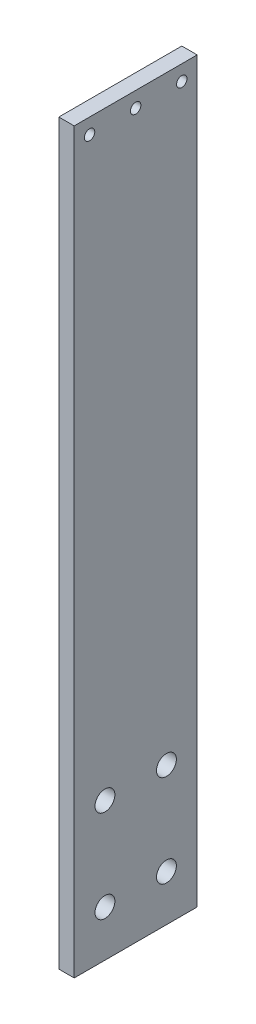
ISO-10303-21;
HEADER;
FILE_DESCRIPTION(('STEP AP214'),'2;1');
FILE_NAME('part.step','',(''),(''),'','','');
FILE_SCHEMA(('AUTOMOTIVE_DESIGN { 1 0 10303 214 1 1 1 1 }'));
ENDSEC;
DATA;
#1=APPLICATION_CONTEXT('core data for automotive mechanical design processes');
#2=APPLICATION_PROTOCOL_DEFINITION('international standard','automotive_design',2000,#1);
#3=PRODUCT_CONTEXT('',#1,'mechanical');
#4=PRODUCT('Part','Part','',(#3));
#5=PRODUCT_RELATED_PRODUCT_CATEGORY('part','',(#4));
#6=PRODUCT_DEFINITION_FORMATION('','',#4);
#7=PRODUCT_DEFINITION_CONTEXT('part definition',#1,'design');
#8=PRODUCT_DEFINITION('design','',#6,#7);
#9=PRODUCT_DEFINITION_SHAPE('','',#8);
#10=(LENGTH_UNIT() NAMED_UNIT(*) SI_UNIT(.MILLI.,.METRE.));
#11=(NAMED_UNIT(*) PLANE_ANGLE_UNIT() SI_UNIT($,.RADIAN.));
#12=(NAMED_UNIT(*) SI_UNIT($,.STERADIAN.) SOLID_ANGLE_UNIT());
#13=UNCERTAINTY_MEASURE_WITH_UNIT(LENGTH_MEASURE(1.E-05),#10,'distance_accuracy_value','');
#14=(GEOMETRIC_REPRESENTATION_CONTEXT(3) GLOBAL_UNCERTAINTY_ASSIGNED_CONTEXT((#13)) GLOBAL_UNIT_ASSIGNED_CONTEXT((#10,
#11,#12)) REPRESENTATION_CONTEXT('',''));
#15=CARTESIAN_POINT('',(0.,0.,0.));
#16=DIRECTION('',(0.,0.,1.));
#17=DIRECTION('',(1.,0.,0.));
#18=AXIS2_PLACEMENT_3D('',#15,#16,#17);
#19=CARTESIAN_POINT('',(-6.35,152.4,-25.4));
#20=DIRECTION('',(0.,0.,-1.));
#21=DIRECTION('',(0.,1.,0.));
#22=AXIS2_PLACEMENT_3D('',#19,#20,#21);
#23=PLANE('',#22);
#24=DIRECTION('',(0.,1.,0.));
#25=VECTOR('',#24,1.);
#26=CARTESIAN_POINT('',(0.,152.4,-25.4));
#27=LINE('',#26,#25);
#28=CARTESIAN_POINT('',(0.,-152.4,-25.4));
#29=VERTEX_POINT('',#28);
#30=CARTESIAN_POINT('',(0.,152.4,-25.4));
#31=VERTEX_POINT('',#30);
#32=EDGE_CURVE('E97',#29,#31,#27,.T.);
#33=ORIENTED_EDGE('',*,*,#32,.F.);
#34=DIRECTION('',(1.,0.,0.));
#35=VECTOR('',#34,1.);
#36=CARTESIAN_POINT('',(-6.35,-152.4,-25.4));
#37=LINE('',#36,#35);
#38=CARTESIAN_POINT('',(-6.35,-152.4,-25.4));
#39=VERTEX_POINT('',#38);
#40=EDGE_CURVE('E11',#39,#29,#37,.T.);
#41=ORIENTED_EDGE('',*,*,#40,.F.);
#42=DIRECTION('',(0.,1.,0.));
#43=VECTOR('',#42,1.);
#44=CARTESIAN_POINT('',(-6.35,152.4,-25.4));
#45=LINE('',#44,#43);
#46=CARTESIAN_POINT('',(-6.35,152.4,-25.4));
#47=VERTEX_POINT('',#46);
#48=EDGE_CURVE('E90',#39,#47,#45,.T.);
#49=ORIENTED_EDGE('',*,*,#48,.T.);
#50=DIRECTION('',(1.,0.,0.));
#51=VECTOR('',#50,1.);
#52=CARTESIAN_POINT('',(-6.35,152.4,-25.4));
#53=LINE('',#52,#51);
#54=EDGE_CURVE('E35',#47,#31,#53,.T.);
#55=ORIENTED_EDGE('',*,*,#54,.T.);
#56=EDGE_LOOP('',(#33,#41,#49,#55));
#57=FACE_BOUND('',#56,.T.);
#58=ADVANCED_FACE('F32',(#57),#23,.T.);
#59=CARTESIAN_POINT('',(-6.35,-152.4,25.4));
#60=DIRECTION('',(0.,-1.,0.));
#61=DIRECTION('',(0.,0.,-1.));
#62=AXIS2_PLACEMENT_3D('',#59,#60,#61);
#63=PLANE('',#62);
#64=DIRECTION('',(0.,0.,-1.));
#65=VECTOR('',#64,1.);
#66=CARTESIAN_POINT('',(0.,-152.4,25.4));
#67=LINE('',#66,#65);
#68=CARTESIAN_POINT('',(0.,-152.4,25.4));
#69=VERTEX_POINT('',#68);
#70=EDGE_CURVE('E92',#69,#29,#67,.T.);
#71=ORIENTED_EDGE('',*,*,#70,.F.);
#72=DIRECTION('',(1.,0.,0.));
#73=VECTOR('',#72,1.);
#74=CARTESIAN_POINT('',(-6.35,-152.4,25.4));
#75=LINE('',#74,#73);
#76=CARTESIAN_POINT('',(-6.35,-152.4,25.4));
#77=VERTEX_POINT('',#76);
#78=EDGE_CURVE('E41',#77,#69,#75,.T.);
#79=ORIENTED_EDGE('',*,*,#78,.F.);
#80=DIRECTION('',(0.,0.,-1.));
#81=VECTOR('',#80,1.);
#82=CARTESIAN_POINT('',(-6.35,-152.4,25.4));
#83=LINE('',#82,#81);
#84=EDGE_CURVE('E87',#77,#39,#83,.T.);
#85=ORIENTED_EDGE('',*,*,#84,.T.);
#86=ORIENTED_EDGE('',*,*,#40,.T.);
#87=EDGE_LOOP('',(#71,#79,#85,#86));
#88=FACE_BOUND('',#87,.T.);
#89=ADVANCED_FACE('F108',(#88),#63,.T.);
#90=CARTESIAN_POINT('',(-6.35,152.4,25.4));
#91=DIRECTION('',(0.,0.,1.));
#92=DIRECTION('',(0.,-1.,0.));
#93=AXIS2_PLACEMENT_3D('',#90,#91,#92);
#94=PLANE('',#93);
#95=DIRECTION('',(0.,-1.,0.));
#96=VECTOR('',#95,1.);
#97=CARTESIAN_POINT('',(0.,152.4,25.4));
#98=LINE('',#97,#96);
#99=CARTESIAN_POINT('',(0.,152.4,25.4));
#100=VERTEX_POINT('',#99);
#101=EDGE_CURVE('E82',#100,#69,#98,.T.);
#102=ORIENTED_EDGE('',*,*,#101,.F.);
#103=DIRECTION('',(1.,0.,0.));
#104=VECTOR('',#103,1.);
#105=CARTESIAN_POINT('',(-6.35,152.4,25.4));
#106=LINE('',#105,#104);
#107=CARTESIAN_POINT('',(-6.35,152.4,25.4));
#108=VERTEX_POINT('',#107);
#109=EDGE_CURVE('E77',#108,#100,#106,.T.);
#110=ORIENTED_EDGE('',*,*,#109,.F.);
#111=DIRECTION('',(0.,-1.,0.));
#112=VECTOR('',#111,1.);
#113=CARTESIAN_POINT('',(-6.35,152.4,25.4));
#114=LINE('',#113,#112);
#115=EDGE_CURVE('E80',#108,#77,#114,.T.);
#116=ORIENTED_EDGE('',*,*,#115,.T.);
#117=ORIENTED_EDGE('',*,*,#78,.T.);
#118=EDGE_LOOP('',(#102,#110,#116,#117));
#119=FACE_BOUND('',#118,.T.);
#120=ADVANCED_FACE('F79',(#119),#94,.T.);
#121=CARTESIAN_POINT('',(-6.35,152.4,25.4));
#122=DIRECTION('',(0.,1.,0.));
#123=DIRECTION('',(0.,0.,1.));
#124=AXIS2_PLACEMENT_3D('',#121,#122,#123);
#125=PLANE('',#124);
#126=DIRECTION('',(0.,0.,1.));
#127=VECTOR('',#126,1.);
#128=CARTESIAN_POINT('',(0.,152.4,25.4));
#129=LINE('',#128,#127);
#130=EDGE_CURVE('E100',#31,#100,#129,.T.);
#131=ORIENTED_EDGE('',*,*,#130,.F.);
#132=ORIENTED_EDGE('',*,*,#54,.F.);
#133=DIRECTION('',(0.,0.,1.));
#134=VECTOR('',#133,1.);
#135=CARTESIAN_POINT('',(-6.35,152.4,25.4));
#136=LINE('',#135,#134);
#137=EDGE_CURVE('E86',#47,#108,#136,.T.);
#138=ORIENTED_EDGE('',*,*,#137,.T.);
#139=ORIENTED_EDGE('',*,*,#109,.T.);
#140=EDGE_LOOP('',(#131,#132,#138,#139));
#141=FACE_BOUND('',#140,.T.);
#142=ADVANCED_FACE('F89',(#141),#125,.T.);
#143=CARTESIAN_POINT('',(-6.35,0.,0.));
#144=DIRECTION('',(1.,0.,0.));
#145=DIRECTION('',(0.,0.,-1.));
#146=AXIS2_PLACEMENT_3D('',#143,#144,#145);
#147=PLANE('',#146);
#148=CARTESIAN_POINT('',(-6.35,146.05,-19.05));
#149=DIRECTION('',(1.,0.,0.));
#150=DIRECTION('',(0.,0.,-1.));
#151=AXIS2_PLACEMENT_3D('',#148,#149,#150);
#152=CIRCLE('',#151,2.15265);
#153=CARTESIAN_POINT('',(-6.35,146.05,-21.20265));
#154=VERTEX_POINT('',#153);
#155=EDGE_CURVE('E177',#154,#154,#152,.T.);
#156=ORIENTED_EDGE('',*,*,#155,.T.);
#157=EDGE_LOOP('',(#156));
#158=FACE_BOUND('',#157,.T.);
#159=CARTESIAN_POINT('',(-6.35,146.05,0.));
#160=DIRECTION('',(1.,0.,0.));
#161=DIRECTION('',(0.,0.,-1.));
#162=AXIS2_PLACEMENT_3D('',#159,#160,#161);
#163=CIRCLE('',#162,2.15265);
#164=CARTESIAN_POINT('',(-6.35,146.05,-2.15264999999998));
#165=VERTEX_POINT('',#164);
#166=EDGE_CURVE('E167',#165,#165,#163,.T.);
#167=ORIENTED_EDGE('',*,*,#166,.T.);
#168=EDGE_LOOP('',(#167));
#169=FACE_BOUND('',#168,.T.);
#170=CARTESIAN_POINT('',(-6.35,-133.35,12.7));
#171=DIRECTION('',(1.,0.,0.));
#172=DIRECTION('',(0.,0.,-1.));
#173=AXIS2_PLACEMENT_3D('',#170,#171,#172);
#174=CIRCLE('',#173,4.10210000000001);
#175=CARTESIAN_POINT('',(-6.35,-133.35,8.59790000000002));
#176=VERTEX_POINT('',#175);
#177=EDGE_CURVE('E162',#176,#176,#174,.T.);
#178=ORIENTED_EDGE('',*,*,#177,.T.);
#179=EDGE_LOOP('',(#178));
#180=FACE_BOUND('',#179,.T.);
#181=CARTESIAN_POINT('',(-6.35,-133.35,-12.7));
#182=DIRECTION('',(1.,0.,0.));
#183=DIRECTION('',(0.,0.,-1.));
#184=AXIS2_PLACEMENT_3D('',#181,#182,#183);
#185=CIRCLE('',#184,4.10210000000001);
#186=CARTESIAN_POINT('',(-6.35,-133.35,-16.8021));
#187=VERTEX_POINT('',#186);
#188=EDGE_CURVE('E195',#187,#187,#185,.T.);
#189=ORIENTED_EDGE('',*,*,#188,.T.);
#190=EDGE_LOOP('',(#189));
#191=FACE_BOUND('',#190,.T.);
#192=CARTESIAN_POINT('',(-6.35,-95.25,-12.7));
#193=DIRECTION('',(1.,0.,0.));
#194=DIRECTION('',(0.,0.,-1.));
#195=AXIS2_PLACEMENT_3D('',#192,#193,#194);
#196=CIRCLE('',#195,4.10210000000001);
#197=CARTESIAN_POINT('',(-6.35,-95.25,-16.8021));
#198=VERTEX_POINT('',#197);
#199=EDGE_CURVE('E189',#198,#198,#196,.T.);
#200=ORIENTED_EDGE('',*,*,#199,.T.);
#201=EDGE_LOOP('',(#200));
#202=FACE_BOUND('',#201,.T.);
#203=CARTESIAN_POINT('',(-6.35,146.05,19.05));
#204=DIRECTION('',(1.,0.,0.));
#205=DIRECTION('',(0.,0.,-1.));
#206=AXIS2_PLACEMENT_3D('',#203,#204,#205);
#207=CIRCLE('',#206,2.15265);
#208=CARTESIAN_POINT('',(-6.35,146.05,16.89735));
#209=VERTEX_POINT('',#208);
#210=EDGE_CURVE('E182',#209,#209,#207,.T.);
#211=ORIENTED_EDGE('',*,*,#210,.T.);
#212=EDGE_LOOP('',(#211));
#213=FACE_BOUND('',#212,.T.);
#214=CARTESIAN_POINT('',(-6.35,-95.25,12.7));
#215=DIRECTION('',(1.,0.,0.));
#216=DIRECTION('',(0.,0.,-1.));
#217=AXIS2_PLACEMENT_3D('',#214,#215,#216);
#218=CIRCLE('',#217,4.10210000000001);
#219=CARTESIAN_POINT('',(-6.35,-95.25,8.59790000000002));
#220=VERTEX_POINT('',#219);
#221=EDGE_CURVE('E101',#220,#220,#218,.T.);
#222=ORIENTED_EDGE('',*,*,#221,.T.);
#223=EDGE_LOOP('',(#222));
#224=FACE_BOUND('',#223,.T.);
#225=ORIENTED_EDGE('',*,*,#48,.F.);
#226=ORIENTED_EDGE('',*,*,#84,.F.);
#227=ORIENTED_EDGE('',*,*,#115,.F.);
#228=ORIENTED_EDGE('',*,*,#137,.F.);
#229=EDGE_LOOP('',(#225,#226,#227,#228));
#230=FACE_BOUND('',#229,.T.);
#231=ADVANCED_FACE('F85',(#158,#169,#180,#191,#202,#213,#224,#230),#147,.F.);
#232=CARTESIAN_POINT('',(0.,0.,0.));
#233=DIRECTION('',(1.,0.,0.));
#234=DIRECTION('',(0.,0.,-1.));
#235=AXIS2_PLACEMENT_3D('',#232,#233,#234);
#236=PLANE('',#235);
#237=CARTESIAN_POINT('',(0.,146.05,-19.05));
#238=DIRECTION('',(1.,0.,0.));
#239=DIRECTION('',(0.,0.,-1.));
#240=AXIS2_PLACEMENT_3D('',#237,#238,#239);
#241=CIRCLE('',#240,2.15265);
#242=CARTESIAN_POINT('',(0.,146.05,-21.20265));
#243=VERTEX_POINT('',#242);
#244=EDGE_CURVE('E179',#243,#243,#241,.T.);
#245=ORIENTED_EDGE('',*,*,#244,.F.);
#246=EDGE_LOOP('',(#245));
#247=FACE_BOUND('',#246,.T.);
#248=CARTESIAN_POINT('',(0.,146.05,0.));
#249=DIRECTION('',(1.,0.,0.));
#250=DIRECTION('',(0.,0.,-1.));
#251=AXIS2_PLACEMENT_3D('',#248,#249,#250);
#252=CIRCLE('',#251,2.15265);
#253=CARTESIAN_POINT('',(0.,146.05,-2.15264999999998));
#254=VERTEX_POINT('',#253);
#255=EDGE_CURVE('E172',#254,#254,#252,.T.);
#256=ORIENTED_EDGE('',*,*,#255,.F.);
#257=EDGE_LOOP('',(#256));
#258=FACE_BOUND('',#257,.T.);
#259=CARTESIAN_POINT('',(0.,-133.35,12.7));
#260=DIRECTION('',(1.,0.,0.));
#261=DIRECTION('',(0.,0.,-1.));
#262=AXIS2_PLACEMENT_3D('',#259,#260,#261);
#263=CIRCLE('',#262,4.10210000000001);
#264=CARTESIAN_POINT('',(0.,-133.35,8.59790000000002));
#265=VERTEX_POINT('',#264);
#266=EDGE_CURVE('E165',#265,#265,#263,.T.);
#267=ORIENTED_EDGE('',*,*,#266,.F.);
#268=EDGE_LOOP('',(#267));
#269=FACE_BOUND('',#268,.T.);
#270=CARTESIAN_POINT('',(0.,-133.35,-12.7));
#271=DIRECTION('',(1.,0.,0.));
#272=DIRECTION('',(0.,0.,-1.));
#273=AXIS2_PLACEMENT_3D('',#270,#271,#272);
#274=CIRCLE('',#273,4.10210000000001);
#275=CARTESIAN_POINT('',(0.,-133.35,-16.8021));
#276=VERTEX_POINT('',#275);
#277=EDGE_CURVE('E169',#276,#276,#274,.T.);
#278=ORIENTED_EDGE('',*,*,#277,.F.);
#279=EDGE_LOOP('',(#278));
#280=FACE_BOUND('',#279,.T.);
#281=CARTESIAN_POINT('',(0.,-95.25,-12.7));
#282=DIRECTION('',(1.,0.,0.));
#283=DIRECTION('',(0.,0.,-1.));
#284=AXIS2_PLACEMENT_3D('',#281,#282,#283);
#285=CIRCLE('',#284,4.10210000000001);
#286=CARTESIAN_POINT('',(0.,-95.25,-16.8021));
#287=VERTEX_POINT('',#286);
#288=EDGE_CURVE('E192',#287,#287,#285,.T.);
#289=ORIENTED_EDGE('',*,*,#288,.F.);
#290=EDGE_LOOP('',(#289));
#291=FACE_BOUND('',#290,.T.);
#292=CARTESIAN_POINT('',(0.,146.05,19.05));
#293=DIRECTION('',(1.,0.,0.));
#294=DIRECTION('',(0.,0.,-1.));
#295=AXIS2_PLACEMENT_3D('',#292,#293,#294);
#296=CIRCLE('',#295,2.15265);
#297=CARTESIAN_POINT('',(0.,146.05,16.89735));
#298=VERTEX_POINT('',#297);
#299=EDGE_CURVE('E186',#298,#298,#296,.T.);
#300=ORIENTED_EDGE('',*,*,#299,.F.);
#301=EDGE_LOOP('',(#300));
#302=FACE_BOUND('',#301,.T.);
#303=CARTESIAN_POINT('',(0.,-95.25,12.7));
#304=DIRECTION('',(1.,0.,0.));
#305=DIRECTION('',(0.,0.,-1.));
#306=AXIS2_PLACEMENT_3D('',#303,#304,#305);
#307=CIRCLE('',#306,4.10210000000001);
#308=CARTESIAN_POINT('',(0.,-95.25,8.59790000000002));
#309=VERTEX_POINT('',#308);
#310=EDGE_CURVE('E185',#309,#309,#307,.T.);
#311=ORIENTED_EDGE('',*,*,#310,.F.);
#312=EDGE_LOOP('',(#311));
#313=FACE_BOUND('',#312,.T.);
#314=ORIENTED_EDGE('',*,*,#32,.T.);
#315=ORIENTED_EDGE('',*,*,#130,.T.);
#316=ORIENTED_EDGE('',*,*,#101,.T.);
#317=ORIENTED_EDGE('',*,*,#70,.T.);
#318=EDGE_LOOP('',(#314,#315,#316,#317));
#319=FACE_BOUND('',#318,.T.);
#320=ADVANCED_FACE('F107',(#247,#258,#269,#280,#291,#302,#313,#319),#236,.T.);
#321=CARTESIAN_POINT('',(-6.35,-95.25,12.7));
#322=DIRECTION('',(1.,0.,0.));
#323=DIRECTION('',(0.,0.,-1.));
#324=AXIS2_PLACEMENT_3D('',#321,#322,#323);
#325=CYLINDRICAL_SURFACE('',#324,4.10210000000001);
#326=ORIENTED_EDGE('',*,*,#221,.F.);
#327=EDGE_LOOP('',(#326));
#328=FACE_BOUND('',#327,.T.);
#329=ORIENTED_EDGE('',*,*,#310,.T.);
#330=EDGE_LOOP('',(#329));
#331=FACE_BOUND('',#330,.T.);
#332=ADVANCED_FACE('F126',(#328,#331),#325,.F.);
#333=CARTESIAN_POINT('',(-6.35,146.05,19.05));
#334=DIRECTION('',(1.,0.,0.));
#335=DIRECTION('',(0.,0.,-1.));
#336=AXIS2_PLACEMENT_3D('',#333,#334,#335);
#337=CYLINDRICAL_SURFACE('',#336,2.15265);
#338=ORIENTED_EDGE('',*,*,#210,.F.);
#339=EDGE_LOOP('',(#338));
#340=FACE_BOUND('',#339,.T.);
#341=ORIENTED_EDGE('',*,*,#299,.T.);
#342=EDGE_LOOP('',(#341));
#343=FACE_BOUND('',#342,.T.);
#344=ADVANCED_FACE('F133',(#340,#343),#337,.F.);
#345=CARTESIAN_POINT('',(-6.35,-95.25,-12.7));
#346=DIRECTION('',(1.,0.,0.));
#347=DIRECTION('',(0.,0.,-1.));
#348=AXIS2_PLACEMENT_3D('',#345,#346,#347);
#349=CYLINDRICAL_SURFACE('',#348,4.10210000000001);
#350=ORIENTED_EDGE('',*,*,#199,.F.);
#351=EDGE_LOOP('',(#350));
#352=FACE_BOUND('',#351,.T.);
#353=ORIENTED_EDGE('',*,*,#288,.T.);
#354=EDGE_LOOP('',(#353));
#355=FACE_BOUND('',#354,.T.);
#356=ADVANCED_FACE('F139',(#352,#355),#349,.F.);
#357=CARTESIAN_POINT('',(-6.35,-133.35,-12.7));
#358=DIRECTION('',(1.,0.,0.));
#359=DIRECTION('',(0.,0.,-1.));
#360=AXIS2_PLACEMENT_3D('',#357,#358,#359);
#361=CYLINDRICAL_SURFACE('',#360,4.10210000000001);
#362=ORIENTED_EDGE('',*,*,#188,.F.);
#363=EDGE_LOOP('',(#362));
#364=FACE_BOUND('',#363,.T.);
#365=ORIENTED_EDGE('',*,*,#277,.T.);
#366=EDGE_LOOP('',(#365));
#367=FACE_BOUND('',#366,.T.);
#368=ADVANCED_FACE('F135',(#364,#367),#361,.F.);
#369=CARTESIAN_POINT('',(-6.35,-133.35,12.7));
#370=DIRECTION('',(1.,0.,0.));
#371=DIRECTION('',(0.,0.,-1.));
#372=AXIS2_PLACEMENT_3D('',#369,#370,#371);
#373=CYLINDRICAL_SURFACE('',#372,4.10210000000001);
#374=ORIENTED_EDGE('',*,*,#177,.F.);
#375=EDGE_LOOP('',(#374));
#376=FACE_BOUND('',#375,.T.);
#377=ORIENTED_EDGE('',*,*,#266,.T.);
#378=EDGE_LOOP('',(#377));
#379=FACE_BOUND('',#378,.T.);
#380=ADVANCED_FACE('F138',(#376,#379),#373,.F.);
#381=CARTESIAN_POINT('',(-6.35,146.05,0.));
#382=DIRECTION('',(1.,0.,0.));
#383=DIRECTION('',(0.,0.,-1.));
#384=AXIS2_PLACEMENT_3D('',#381,#382,#383);
#385=CYLINDRICAL_SURFACE('',#384,2.15265);
#386=ORIENTED_EDGE('',*,*,#166,.F.);
#387=EDGE_LOOP('',(#386));
#388=FACE_BOUND('',#387,.T.);
#389=ORIENTED_EDGE('',*,*,#255,.T.);
#390=EDGE_LOOP('',(#389));
#391=FACE_BOUND('',#390,.T.);
#392=ADVANCED_FACE('F150',(#388,#391),#385,.F.);
#393=CARTESIAN_POINT('',(-6.35,146.05,-19.05));
#394=DIRECTION('',(1.,0.,0.));
#395=DIRECTION('',(0.,0.,-1.));
#396=AXIS2_PLACEMENT_3D('',#393,#394,#395);
#397=CYLINDRICAL_SURFACE('',#396,2.15265);
#398=ORIENTED_EDGE('',*,*,#155,.F.);
#399=EDGE_LOOP('',(#398));
#400=FACE_BOUND('',#399,.T.);
#401=ORIENTED_EDGE('',*,*,#244,.T.);
#402=EDGE_LOOP('',(#401));
#403=FACE_BOUND('',#402,.T.);
#404=ADVANCED_FACE('F147',(#400,#403),#397,.F.);
#405=CLOSED_SHELL('',(#58,#89,#120,#142,#231,#320,#332,#344,#356,#368,#380,#392,#404));
#406=MANIFOLD_SOLID_BREP('B2',#405);
#407=ADVANCED_BREP_SHAPE_REPRESENTATION('',(#18,#406),#14);
#408=SHAPE_DEFINITION_REPRESENTATION(#9,#407);
ENDSEC;
END-ISO-10303-21;
